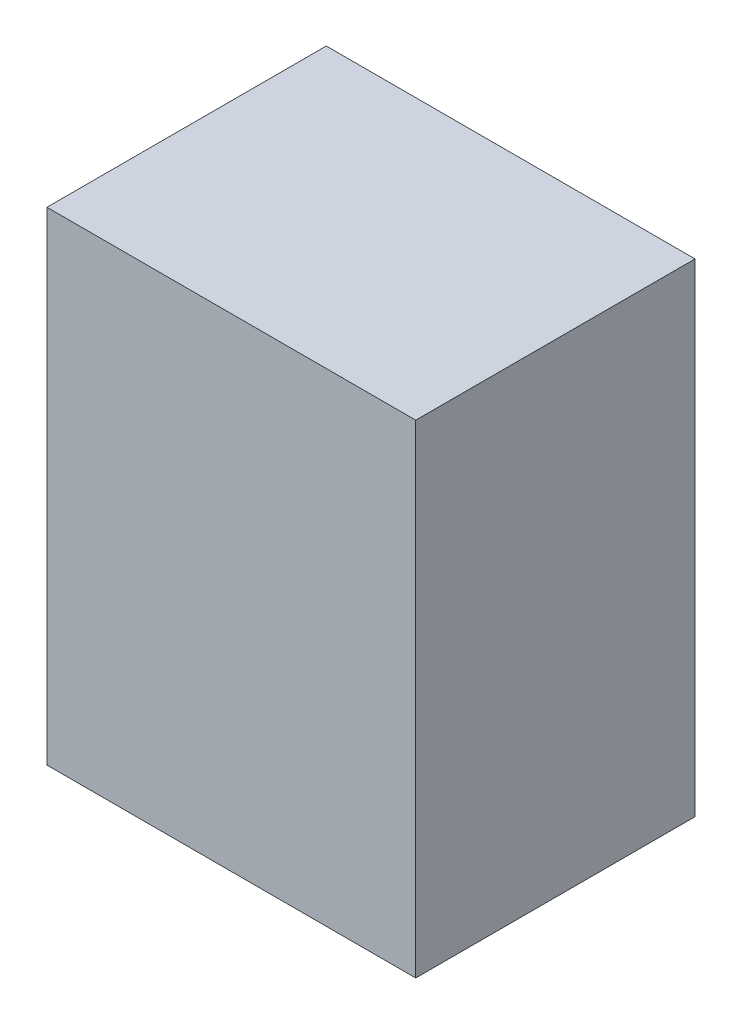
ISO-10303-21;
HEADER;
FILE_DESCRIPTION(('STEP AP214'),'2;1');
FILE_NAME('part.step','',(''),(''),'','','');
FILE_SCHEMA(('AUTOMOTIVE_DESIGN { 1 0 10303 214 1 1 1 1 }'));
ENDSEC;
DATA;
#1=APPLICATION_CONTEXT('core data for automotive mechanical design processes');
#2=APPLICATION_PROTOCOL_DEFINITION('international standard','automotive_design',2000,#1);
#3=PRODUCT_CONTEXT('',#1,'mechanical');
#4=PRODUCT('Part','Part','',(#3));
#5=PRODUCT_RELATED_PRODUCT_CATEGORY('part','',(#4));
#6=PRODUCT_DEFINITION_FORMATION('','',#4);
#7=PRODUCT_DEFINITION_CONTEXT('part definition',#1,'design');
#8=PRODUCT_DEFINITION('design','',#6,#7);
#9=PRODUCT_DEFINITION_SHAPE('','',#8);
#10=(LENGTH_UNIT() NAMED_UNIT(*) SI_UNIT(.MILLI.,.METRE.));
#11=(NAMED_UNIT(*) PLANE_ANGLE_UNIT() SI_UNIT($,.RADIAN.));
#12=(NAMED_UNIT(*) SI_UNIT($,.STERADIAN.) SOLID_ANGLE_UNIT());
#13=UNCERTAINTY_MEASURE_WITH_UNIT(LENGTH_MEASURE(1.E-05),#10,'distance_accuracy_value','');
#14=(GEOMETRIC_REPRESENTATION_CONTEXT(3) GLOBAL_UNCERTAINTY_ASSIGNED_CONTEXT((#13)) GLOBAL_UNIT_ASSIGNED_CONTEXT((#10,
#11,#12)) REPRESENTATION_CONTEXT('',''));
#15=CARTESIAN_POINT('',(0.,0.,0.));
#16=DIRECTION('',(0.,0.,1.));
#17=DIRECTION('',(1.,0.,0.));
#18=AXIS2_PLACEMENT_3D('',#15,#16,#17);
#19=CARTESIAN_POINT('',(69.4645000000004,-17.63,7.25));
#20=DIRECTION('',(1.,0.,0.));
#21=DIRECTION('',(0.,0.,-1.));
#22=AXIS2_PLACEMENT_3D('',#19,#20,#21);
#23=PLANE('',#22);
#24=DIRECTION('',(0.,-1.,0.));
#25=VECTOR('',#24,1.);
#26=CARTESIAN_POINT('',(69.4645000000004,-17.63,0.));
#27=LINE('',#26,#25);
#28=CARTESIAN_POINT('',(69.4645000000004,-17.63,0.));
#29=VERTEX_POINT('',#28);
#30=CARTESIAN_POINT('',(69.4645000000004,-30.17,0.));
#31=VERTEX_POINT('',#30);
#32=EDGE_CURVE('E128',#29,#31,#27,.T.);
#33=ORIENTED_EDGE('',*,*,#32,.T.);
#34=DIRECTION('',(0.,0.,-1.));
#35=VECTOR('',#34,1.);
#36=CARTESIAN_POINT('',(69.4645000000004,-30.17,7.25));
#37=LINE('',#36,#35);
#38=CARTESIAN_POINT('',(69.4645000000004,-30.17,7.25));
#39=VERTEX_POINT('',#38);
#40=EDGE_CURVE('E11',#39,#31,#37,.T.);
#41=ORIENTED_EDGE('',*,*,#40,.F.);
#42=DIRECTION('',(0.,-1.,0.));
#43=VECTOR('',#42,1.);
#44=CARTESIAN_POINT('',(69.4645000000004,-17.63,7.25));
#45=LINE('',#44,#43);
#46=CARTESIAN_POINT('',(69.4645000000004,-17.63,7.25));
#47=VERTEX_POINT('',#46);
#48=EDGE_CURVE('E148',#47,#39,#45,.T.);
#49=ORIENTED_EDGE('',*,*,#48,.F.);
#50=DIRECTION('',(0.,0.,-1.));
#51=VECTOR('',#50,1.);
#52=CARTESIAN_POINT('',(69.4645000000004,-17.63,7.25));
#53=LINE('',#52,#51);
#54=EDGE_CURVE('E153',#47,#29,#53,.T.);
#55=ORIENTED_EDGE('',*,*,#54,.T.);
#56=EDGE_LOOP('',(#33,#41,#49,#55));
#57=FACE_BOUND('',#56,.T.);
#58=ADVANCED_FACE('F32',(#57),#23,.F.);
#59=CARTESIAN_POINT('',(69.4645000000004,-30.17,7.25));
#60=DIRECTION('',(0.,1.,0.));
#61=DIRECTION('',(0.,0.,1.));
#62=AXIS2_PLACEMENT_3D('',#59,#60,#61);
#63=PLANE('',#62);
#64=DIRECTION('',(1.,0.,0.));
#65=VECTOR('',#64,1.);
#66=CARTESIAN_POINT('',(69.4645000000004,-30.17,0.));
#67=LINE('',#66,#65);
#68=CARTESIAN_POINT('',(79.0368014902547,-30.17,0.));
#69=VERTEX_POINT('',#68);
#70=EDGE_CURVE('E132',#31,#69,#67,.T.);
#71=ORIENTED_EDGE('',*,*,#70,.T.);
#72=DIRECTION('',(0.,0.,-1.));
#73=VECTOR('',#72,1.);
#74=CARTESIAN_POINT('',(79.0368014902547,-30.17,7.25));
#75=LINE('',#74,#73);
#76=CARTESIAN_POINT('',(79.0368014902547,-30.17,7.25));
#77=VERTEX_POINT('',#76);
#78=EDGE_CURVE('E39',#77,#69,#75,.T.);
#79=ORIENTED_EDGE('',*,*,#78,.F.);
#80=DIRECTION('',(1.,0.,0.));
#81=VECTOR('',#80,1.);
#82=CARTESIAN_POINT('',(69.4645000000004,-30.17,7.25));
#83=LINE('',#82,#81);
#84=EDGE_CURVE('E83',#39,#77,#83,.T.);
#85=ORIENTED_EDGE('',*,*,#84,.F.);
#86=ORIENTED_EDGE('',*,*,#40,.T.);
#87=EDGE_LOOP('',(#71,#79,#85,#86));
#88=FACE_BOUND('',#87,.T.);
#89=ADVANCED_FACE('F182',(#88),#63,.F.);
#90=CARTESIAN_POINT('',(79.0368014902547,-17.63,7.25));
#91=DIRECTION('',(-1.,0.,0.));
#92=DIRECTION('',(0.,0.,1.));
#93=AXIS2_PLACEMENT_3D('',#90,#91,#92);
#94=PLANE('',#93);
#95=DIRECTION('',(0.,1.,0.));
#96=VECTOR('',#95,1.);
#97=CARTESIAN_POINT('',(79.0368014902547,-17.63,0.));
#98=LINE('',#97,#96);
#99=CARTESIAN_POINT('',(79.0368014902547,-17.63,0.));
#100=VERTEX_POINT('',#99);
#101=EDGE_CURVE('E156',#69,#100,#98,.T.);
#102=ORIENTED_EDGE('',*,*,#101,.T.);
#103=DIRECTION('',(0.,0.,-1.));
#104=VECTOR('',#103,1.);
#105=CARTESIAN_POINT('',(79.0368014902547,-17.63,7.25));
#106=LINE('',#105,#104);
#107=CARTESIAN_POINT('',(79.0368014902547,-17.63,7.25));
#108=VERTEX_POINT('',#107);
#109=EDGE_CURVE('E160',#108,#100,#106,.T.);
#110=ORIENTED_EDGE('',*,*,#109,.F.);
#111=DIRECTION('',(0.,1.,0.));
#112=VECTOR('',#111,1.);
#113=CARTESIAN_POINT('',(79.0368014902547,-17.63,7.25));
#114=LINE('',#113,#112);
#115=EDGE_CURVE('E151',#77,#108,#114,.T.);
#116=ORIENTED_EDGE('',*,*,#115,.F.);
#117=ORIENTED_EDGE('',*,*,#78,.T.);
#118=EDGE_LOOP('',(#102,#110,#116,#117));
#119=FACE_BOUND('',#118,.T.);
#120=ADVANCED_FACE('F165',(#119),#94,.F.);
#121=CARTESIAN_POINT('',(69.4645000000004,-17.63,7.25));
#122=DIRECTION('',(0.,-1.,0.));
#123=DIRECTION('',(0.,0.,-1.));
#124=AXIS2_PLACEMENT_3D('',#121,#122,#123);
#125=PLANE('',#124);
#126=DIRECTION('',(-1.,0.,0.));
#127=VECTOR('',#126,1.);
#128=CARTESIAN_POINT('',(69.4645000000004,-17.63,0.));
#129=LINE('',#128,#127);
#130=EDGE_CURVE('E76',#100,#29,#129,.T.);
#131=ORIENTED_EDGE('',*,*,#130,.T.);
#132=ORIENTED_EDGE('',*,*,#54,.F.);
#133=DIRECTION('',(-1.,0.,0.));
#134=VECTOR('',#133,1.);
#135=CARTESIAN_POINT('',(69.4645000000004,-17.63,7.25));
#136=LINE('',#135,#134);
#137=EDGE_CURVE('E55',#108,#47,#136,.T.);
#138=ORIENTED_EDGE('',*,*,#137,.F.);
#139=ORIENTED_EDGE('',*,*,#109,.T.);
#140=EDGE_LOOP('',(#131,#132,#138,#139));
#141=FACE_BOUND('',#140,.T.);
#142=ADVANCED_FACE('F173',(#141),#125,.F.);
#143=CARTESIAN_POINT('',(0.,0.,7.25));
#144=DIRECTION('',(0.,0.,1.));
#145=DIRECTION('',(1.,0.,0.));
#146=AXIS2_PLACEMENT_3D('',#143,#144,#145);
#147=PLANE('',#146);
#148=ORIENTED_EDGE('',*,*,#48,.T.);
#149=ORIENTED_EDGE('',*,*,#84,.T.);
#150=ORIENTED_EDGE('',*,*,#115,.T.);
#151=ORIENTED_EDGE('',*,*,#137,.T.);
#152=EDGE_LOOP('',(#148,#149,#150,#151));
#153=FACE_BOUND('',#152,.T.);
#154=ADVANCED_FACE('F175',(#153),#147,.T.);
#155=CARTESIAN_POINT('',(0.,0.,0.));
#156=DIRECTION('',(0.,0.,1.));
#157=DIRECTION('',(1.,0.,0.));
#158=AXIS2_PLACEMENT_3D('',#155,#156,#157);
#159=PLANE('',#158);
#160=DIRECTION('',(-1.,0.,0.));
#161=VECTOR('',#160,1.);
#162=CARTESIAN_POINT('',(69.4645000000004,-18.13,0.));
#163=LINE('',#162,#161);
#164=CARTESIAN_POINT('',(78.5368014902547,-18.13,0.));
#165=VERTEX_POINT('',#164);
#166=CARTESIAN_POINT('',(69.9645000000004,-18.13,0.));
#167=VERTEX_POINT('',#166);
#168=EDGE_CURVE('E123',#165,#167,#163,.T.);
#169=ORIENTED_EDGE('',*,*,#168,.T.);
#170=DIRECTION('',(0.,-1.,0.));
#171=VECTOR('',#170,1.);
#172=CARTESIAN_POINT('',(69.9645000000004,-17.63,0.));
#173=LINE('',#172,#171);
#174=CARTESIAN_POINT('',(69.9645000000004,-29.67,0.));
#175=VERTEX_POINT('',#174);
#176=EDGE_CURVE('E142',#167,#175,#173,.T.);
#177=ORIENTED_EDGE('',*,*,#176,.T.);
#178=DIRECTION('',(1.,0.,0.));
#179=VECTOR('',#178,1.);
#180=CARTESIAN_POINT('',(69.4645000000004,-29.67,0.));
#181=LINE('',#180,#179);
#182=CARTESIAN_POINT('',(78.5368014902547,-29.67,0.));
#183=VERTEX_POINT('',#182);
#184=EDGE_CURVE('E127',#175,#183,#181,.T.);
#185=ORIENTED_EDGE('',*,*,#184,.T.);
#186=DIRECTION('',(0.,1.,0.));
#187=VECTOR('',#186,1.);
#188=CARTESIAN_POINT('',(78.5368014902547,-17.63,0.));
#189=LINE('',#188,#187);
#190=EDGE_CURVE('E46',#183,#165,#189,.T.);
#191=ORIENTED_EDGE('',*,*,#190,.T.);
#192=EDGE_LOOP('',(#169,#177,#185,#191));
#193=FACE_BOUND('',#192,.T.);
#194=ORIENTED_EDGE('',*,*,#32,.F.);
#195=ORIENTED_EDGE('',*,*,#130,.F.);
#196=ORIENTED_EDGE('',*,*,#101,.F.);
#197=ORIENTED_EDGE('',*,*,#70,.F.);
#198=EDGE_LOOP('',(#194,#195,#196,#197));
#199=FACE_BOUND('',#198,.T.);
#200=ADVANCED_FACE('F169',(#193,#199),#159,.F.);
#201=CARTESIAN_POINT('',(69.9645000000004,-17.63,7.25));
#202=DIRECTION('',(1.,0.,0.));
#203=DIRECTION('',(0.,0.,-1.));
#204=AXIS2_PLACEMENT_3D('',#201,#202,#203);
#205=PLANE('',#204);
#206=ORIENTED_EDGE('',*,*,#176,.F.);
#207=DIRECTION('',(0.,0.,-1.));
#208=VECTOR('',#207,1.);
#209=CARTESIAN_POINT('',(69.9645000000004,-18.13,7.25));
#210=LINE('',#209,#208);
#211=CARTESIAN_POINT('',(69.9645000000004,-18.13,7.05));
#212=VERTEX_POINT('',#211);
#213=EDGE_CURVE('E122',#212,#167,#210,.T.);
#214=ORIENTED_EDGE('',*,*,#213,.F.);
#215=DIRECTION('',(0.,-1.,0.));
#216=VECTOR('',#215,1.);
#217=CARTESIAN_POINT('',(69.9645000000004,-17.63,7.05));
#218=LINE('',#217,#216);
#219=CARTESIAN_POINT('',(69.9645000000004,-29.67,7.05));
#220=VERTEX_POINT('',#219);
#221=EDGE_CURVE('E110',#212,#220,#218,.T.);
#222=ORIENTED_EDGE('',*,*,#221,.T.);
#223=DIRECTION('',(0.,0.,-1.));
#224=VECTOR('',#223,1.);
#225=CARTESIAN_POINT('',(69.9645000000004,-29.67,7.25));
#226=LINE('',#225,#224);
#227=EDGE_CURVE('E120',#220,#175,#226,.T.);
#228=ORIENTED_EDGE('',*,*,#227,.T.);
#229=EDGE_LOOP('',(#206,#214,#222,#228));
#230=FACE_BOUND('',#229,.T.);
#231=ADVANCED_FACE('F119',(#230),#205,.T.);
#232=CARTESIAN_POINT('',(69.4645000000004,-29.67,7.25));
#233=DIRECTION('',(0.,1.,0.));
#234=DIRECTION('',(0.,0.,1.));
#235=AXIS2_PLACEMENT_3D('',#232,#233,#234);
#236=PLANE('',#235);
#237=ORIENTED_EDGE('',*,*,#184,.F.);
#238=ORIENTED_EDGE('',*,*,#227,.F.);
#239=DIRECTION('',(1.,0.,0.));
#240=VECTOR('',#239,1.);
#241=CARTESIAN_POINT('',(69.4645000000004,-29.67,7.05));
#242=LINE('',#241,#240);
#243=CARTESIAN_POINT('',(78.5368014902547,-29.67,7.05));
#244=VERTEX_POINT('',#243);
#245=EDGE_CURVE('E106',#220,#244,#242,.T.);
#246=ORIENTED_EDGE('',*,*,#245,.T.);
#247=DIRECTION('',(0.,0.,-1.));
#248=VECTOR('',#247,1.);
#249=CARTESIAN_POINT('',(78.5368014902547,-29.67,7.25));
#250=LINE('',#249,#248);
#251=EDGE_CURVE('E129',#244,#183,#250,.T.);
#252=ORIENTED_EDGE('',*,*,#251,.T.);
#253=EDGE_LOOP('',(#237,#238,#246,#252));
#254=FACE_BOUND('',#253,.T.);
#255=ADVANCED_FACE('F125',(#254),#236,.T.);
#256=CARTESIAN_POINT('',(78.5368014902547,-17.63,7.25));
#257=DIRECTION('',(-1.,0.,0.));
#258=DIRECTION('',(0.,0.,1.));
#259=AXIS2_PLACEMENT_3D('',#256,#257,#258);
#260=PLANE('',#259);
#261=ORIENTED_EDGE('',*,*,#190,.F.);
#262=ORIENTED_EDGE('',*,*,#251,.F.);
#263=DIRECTION('',(0.,1.,0.));
#264=VECTOR('',#263,1.);
#265=CARTESIAN_POINT('',(78.5368014902547,-17.63,7.05));
#266=LINE('',#265,#264);
#267=CARTESIAN_POINT('',(78.5368014902547,-18.13,7.05));
#268=VERTEX_POINT('',#267);
#269=EDGE_CURVE('E111',#244,#268,#266,.T.);
#270=ORIENTED_EDGE('',*,*,#269,.T.);
#271=DIRECTION('',(0.,0.,-1.));
#272=VECTOR('',#271,1.);
#273=CARTESIAN_POINT('',(78.5368014902547,-18.13,7.25));
#274=LINE('',#273,#272);
#275=EDGE_CURVE('E134',#268,#165,#274,.T.);
#276=ORIENTED_EDGE('',*,*,#275,.T.);
#277=EDGE_LOOP('',(#261,#262,#270,#276));
#278=FACE_BOUND('',#277,.T.);
#279=ADVANCED_FACE('F230',(#278),#260,.T.);
#280=CARTESIAN_POINT('',(69.4645000000004,-18.13,7.25));
#281=DIRECTION('',(0.,-1.,0.));
#282=DIRECTION('',(0.,0.,-1.));
#283=AXIS2_PLACEMENT_3D('',#280,#281,#282);
#284=PLANE('',#283);
#285=ORIENTED_EDGE('',*,*,#168,.F.);
#286=ORIENTED_EDGE('',*,*,#275,.F.);
#287=DIRECTION('',(-1.,0.,0.));
#288=VECTOR('',#287,1.);
#289=CARTESIAN_POINT('',(69.4645000000004,-18.13,7.05));
#290=LINE('',#289,#288);
#291=EDGE_CURVE('E137',#268,#212,#290,.T.);
#292=ORIENTED_EDGE('',*,*,#291,.T.);
#293=ORIENTED_EDGE('',*,*,#213,.T.);
#294=EDGE_LOOP('',(#285,#286,#292,#293));
#295=FACE_BOUND('',#294,.T.);
#296=ADVANCED_FACE('F239',(#295),#284,.T.);
#297=CARTESIAN_POINT('',(0.,0.,7.05));
#298=DIRECTION('',(0.,0.,1.));
#299=DIRECTION('',(1.,0.,0.));
#300=AXIS2_PLACEMENT_3D('',#297,#298,#299);
#301=PLANE('',#300);
#302=ORIENTED_EDGE('',*,*,#221,.F.);
#303=ORIENTED_EDGE('',*,*,#291,.F.);
#304=ORIENTED_EDGE('',*,*,#269,.F.);
#305=ORIENTED_EDGE('',*,*,#245,.F.);
#306=EDGE_LOOP('',(#302,#303,#304,#305));
#307=FACE_BOUND('',#306,.T.);
#308=ADVANCED_FACE('F108',(#307),#301,.F.);
#309=CLOSED_SHELL('',(#58,#89,#120,#142,#154,#200,#231,#255,#279,#296,#308));
#310=MANIFOLD_SOLID_BREP('B2',#309);
#311=ADVANCED_BREP_SHAPE_REPRESENTATION('',(#18,#310),#14);
#312=SHAPE_DEFINITION_REPRESENTATION(#9,#311);
ENDSEC;
END-ISO-10303-21;
